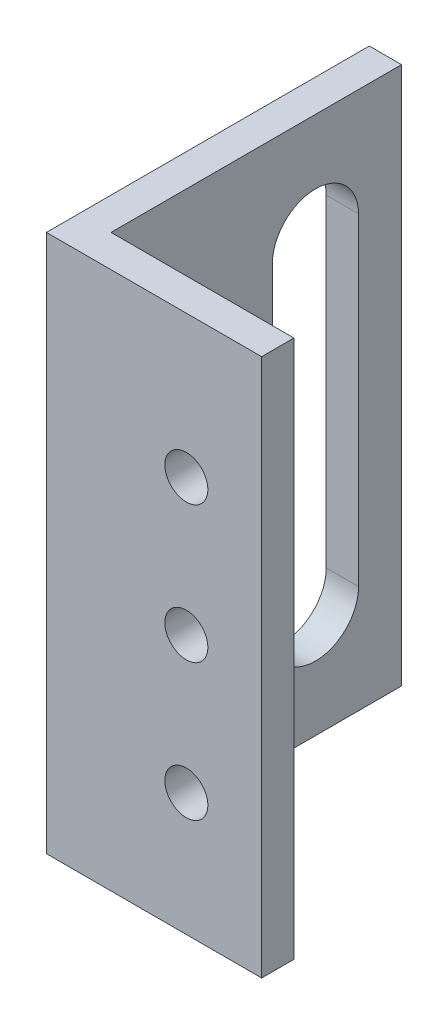
ISO-10303-21;
HEADER;
FILE_DESCRIPTION(('STEP AP214'),'2;1');
FILE_NAME('part.step','',(''),(''),'','','');
FILE_SCHEMA(('AUTOMOTIVE_DESIGN { 1 0 10303 214 1 1 1 1 }'));
ENDSEC;
DATA;
#1=APPLICATION_CONTEXT('core data for automotive mechanical design processes');
#2=APPLICATION_PROTOCOL_DEFINITION('international standard','automotive_design',2000,#1);
#3=PRODUCT_CONTEXT('',#1,'mechanical');
#4=PRODUCT('Part','Part','',(#3));
#5=PRODUCT_RELATED_PRODUCT_CATEGORY('part','',(#4));
#6=PRODUCT_DEFINITION_FORMATION('','',#4);
#7=PRODUCT_DEFINITION_CONTEXT('part definition',#1,'design');
#8=PRODUCT_DEFINITION('design','',#6,#7);
#9=PRODUCT_DEFINITION_SHAPE('','',#8);
#10=(LENGTH_UNIT() NAMED_UNIT(*) SI_UNIT(.MILLI.,.METRE.));
#11=(NAMED_UNIT(*) PLANE_ANGLE_UNIT() SI_UNIT($,.RADIAN.));
#12=(NAMED_UNIT(*) SI_UNIT($,.STERADIAN.) SOLID_ANGLE_UNIT());
#13=UNCERTAINTY_MEASURE_WITH_UNIT(LENGTH_MEASURE(1.E-05),#10,'distance_accuracy_value','');
#14=(GEOMETRIC_REPRESENTATION_CONTEXT(3) GLOBAL_UNCERTAINTY_ASSIGNED_CONTEXT((#13)) GLOBAL_UNIT_ASSIGNED_CONTEXT((#10,
#11,#12)) REPRESENTATION_CONTEXT('',''));
#15=CARTESIAN_POINT('',(0.,0.,0.));
#16=DIRECTION('',(0.,0.,1.));
#17=DIRECTION('',(1.,0.,0.));
#18=AXIS2_PLACEMENT_3D('',#15,#16,#17);
#19=CARTESIAN_POINT('',(-1.5,50.,0.));
#20=DIRECTION('',(1.,0.,0.));
#21=DIRECTION('',(0.,0.,-1.));
#22=AXIS2_PLACEMENT_3D('',#19,#20,#21);
#23=PLANE('',#22);
#24=DIRECTION('',(0.,-1.,0.));
#25=VECTOR('',#24,1.);
#26=CARTESIAN_POINT('',(-1.5,40.,-11.));
#27=LINE('',#26,#25);
#28=CARTESIAN_POINT('',(-1.5,40.,-11.));
#29=VERTEX_POINT('',#28);
#30=CARTESIAN_POINT('',(-1.5,10.,-11.));
#31=VERTEX_POINT('',#30);
#32=EDGE_CURVE('E128',#29,#31,#27,.T.);
#33=ORIENTED_EDGE('',*,*,#32,.F.);
#34=CARTESIAN_POINT('',(-1.5,40.,-7.));
#35=DIRECTION('',(-1.,0.,0.));
#36=DIRECTION('',(0.,0.,1.));
#37=AXIS2_PLACEMENT_3D('',#34,#35,#36);
#38=CIRCLE('',#37,4.);
#39=CARTESIAN_POINT('',(-1.5,40.,-3.));
#40=VERTEX_POINT('',#39);
#41=EDGE_CURVE('E55',#40,#29,#38,.T.);
#42=ORIENTED_EDGE('',*,*,#41,.F.);
#43=DIRECTION('',(0.,1.,0.));
#44=VECTOR('',#43,1.);
#45=CARTESIAN_POINT('',(-1.5,40.,-3.));
#46=LINE('',#45,#44);
#47=CARTESIAN_POINT('',(-1.5,10.,-3.));
#48=VERTEX_POINT('',#47);
#49=EDGE_CURVE('E134',#48,#40,#46,.T.);
#50=ORIENTED_EDGE('',*,*,#49,.F.);
#51=CARTESIAN_POINT('',(-1.5,10.,-7.));
#52=DIRECTION('',(-1.,0.,0.));
#53=DIRECTION('',(0.,0.,1.));
#54=AXIS2_PLACEMENT_3D('',#51,#52,#53);
#55=CIRCLE('',#54,4.);
#56=EDGE_CURVE('E119',#31,#48,#55,.T.);
#57=ORIENTED_EDGE('',*,*,#56,.F.);
#58=EDGE_LOOP('',(#33,#42,#50,#57));
#59=FACE_BOUND('',#58,.T.);
#60=DIRECTION('',(0.,0.,1.));
#61=VECTOR('',#60,1.);
#62=CARTESIAN_POINT('',(-1.5,0.,0.));
#63=LINE('',#62,#61);
#64=CARTESIAN_POINT('',(-1.5,0.,-15.));
#65=VERTEX_POINT('',#64);
#66=CARTESIAN_POINT('',(-1.5,0.,15.));
#67=VERTEX_POINT('',#66);
#68=EDGE_CURVE('E171',#65,#67,#63,.T.);
#69=ORIENTED_EDGE('',*,*,#68,.T.);
#70=DIRECTION('',(0.,-1.,0.));
#71=VECTOR('',#70,1.);
#72=CARTESIAN_POINT('',(-1.5,50.,15.));
#73=LINE('',#72,#71);
#74=CARTESIAN_POINT('',(-1.5,50.,15.));
#75=VERTEX_POINT('',#74);
#76=EDGE_CURVE('E198',#75,#67,#73,.T.);
#77=ORIENTED_EDGE('',*,*,#76,.F.);
#78=DIRECTION('',(0.,0.,1.));
#79=VECTOR('',#78,1.);
#80=CARTESIAN_POINT('',(-1.5,50.,0.));
#81=LINE('',#80,#79);
#82=CARTESIAN_POINT('',(-1.5,50.,-15.));
#83=VERTEX_POINT('',#82);
#84=EDGE_CURVE('E153',#83,#75,#81,.T.);
#85=ORIENTED_EDGE('',*,*,#84,.F.);
#86=DIRECTION('',(0.,-1.,0.));
#87=VECTOR('',#86,1.);
#88=CARTESIAN_POINT('',(-1.5,50.,-15.));
#89=LINE('',#88,#87);
#90=EDGE_CURVE('E170',#83,#65,#89,.T.);
#91=ORIENTED_EDGE('',*,*,#90,.T.);
#92=EDGE_LOOP('',(#69,#77,#85,#91));
#93=FACE_BOUND('',#92,.T.);
#94=ADVANCED_FACE('F41',(#59,#93),#23,.F.);
#95=CARTESIAN_POINT('',(0.,50.,15.));
#96=DIRECTION('',(0.,0.,-1.));
#97=DIRECTION('',(-1.,0.,0.));
#98=AXIS2_PLACEMENT_3D('',#95,#96,#97);
#99=PLANE('',#98);
#100=CARTESIAN_POINT('',(11.5,36.8,15.));
#101=DIRECTION('',(0.,0.,1.));
#102=DIRECTION('',(1.,0.,0.));
#103=AXIS2_PLACEMENT_3D('',#100,#101,#102);
#104=CIRCLE('',#103,2.);
#105=CARTESIAN_POINT('',(13.5,36.8,15.));
#106=VERTEX_POINT('',#105);
#107=EDGE_CURVE('E144',#106,#106,#104,.T.);
#108=ORIENTED_EDGE('',*,*,#107,.F.);
#109=EDGE_LOOP('',(#108));
#110=FACE_BOUND('',#109,.T.);
#111=CARTESIAN_POINT('',(11.5000000000001,24.1,15.));
#112=DIRECTION('',(0.,0.,1.));
#113=DIRECTION('',(1.,0.,0.));
#114=AXIS2_PLACEMENT_3D('',#111,#112,#113);
#115=CIRCLE('',#114,2.);
#116=CARTESIAN_POINT('',(13.5000000000001,24.1,15.));
#117=VERTEX_POINT('',#116);
#118=EDGE_CURVE('E148',#117,#117,#115,.T.);
#119=ORIENTED_EDGE('',*,*,#118,.F.);
#120=EDGE_LOOP('',(#119));
#121=FACE_BOUND('',#120,.T.);
#122=CARTESIAN_POINT('',(11.5000000000003,11.4,15.));
#123=DIRECTION('',(0.,0.,1.));
#124=DIRECTION('',(1.,0.,0.));
#125=AXIS2_PLACEMENT_3D('',#122,#123,#124);
#126=CIRCLE('',#125,2.);
#127=CARTESIAN_POINT('',(13.5000000000003,11.4,15.));
#128=VERTEX_POINT('',#127);
#129=EDGE_CURVE('E141',#128,#128,#126,.T.);
#130=ORIENTED_EDGE('',*,*,#129,.F.);
#131=EDGE_LOOP('',(#130));
#132=FACE_BOUND('',#131,.T.);
#133=DIRECTION('',(1.,0.,0.));
#134=VECTOR('',#133,1.);
#135=CARTESIAN_POINT('',(0.,0.,15.));
#136=LINE('',#135,#134);
#137=CARTESIAN_POINT('',(18.5,0.,15.));
#138=VERTEX_POINT('',#137);
#139=EDGE_CURVE('E174',#67,#138,#136,.T.);
#140=ORIENTED_EDGE('',*,*,#139,.T.);
#141=DIRECTION('',(0.,-1.,0.));
#142=VECTOR('',#141,1.);
#143=CARTESIAN_POINT('',(18.5,50.,15.));
#144=LINE('',#143,#142);
#145=CARTESIAN_POINT('',(18.5,50.,15.));
#146=VERTEX_POINT('',#145);
#147=EDGE_CURVE('E195',#146,#138,#144,.T.);
#148=ORIENTED_EDGE('',*,*,#147,.F.);
#149=DIRECTION('',(1.,0.,0.));
#150=VECTOR('',#149,1.);
#151=CARTESIAN_POINT('',(0.,50.,15.));
#152=LINE('',#151,#150);
#153=EDGE_CURVE('E156',#75,#146,#152,.T.);
#154=ORIENTED_EDGE('',*,*,#153,.F.);
#155=ORIENTED_EDGE('',*,*,#76,.T.);
#156=EDGE_LOOP('',(#140,#148,#154,#155));
#157=FACE_BOUND('',#156,.T.);
#158=ADVANCED_FACE('F233',(#110,#121,#132,#157),#99,.F.);
#159=CARTESIAN_POINT('',(18.5,50.,0.));
#160=DIRECTION('',(-1.,0.,0.));
#161=DIRECTION('',(0.,0.,1.));
#162=AXIS2_PLACEMENT_3D('',#159,#160,#161);
#163=PLANE('',#162);
#164=DIRECTION('',(0.,0.,-1.));
#165=VECTOR('',#164,1.);
#166=CARTESIAN_POINT('',(18.5,0.,0.));
#167=LINE('',#166,#165);
#168=CARTESIAN_POINT('',(18.5,0.,12.));
#169=VERTEX_POINT('',#168);
#170=EDGE_CURVE('E177',#138,#169,#167,.T.);
#171=ORIENTED_EDGE('',*,*,#170,.T.);
#172=DIRECTION('',(0.,-1.,0.));
#173=VECTOR('',#172,1.);
#174=CARTESIAN_POINT('',(18.5,50.,12.));
#175=LINE('',#174,#173);
#176=CARTESIAN_POINT('',(18.5,50.,12.));
#177=VERTEX_POINT('',#176);
#178=EDGE_CURVE('E193',#177,#169,#175,.T.);
#179=ORIENTED_EDGE('',*,*,#178,.F.);
#180=DIRECTION('',(0.,0.,-1.));
#181=VECTOR('',#180,1.);
#182=CARTESIAN_POINT('',(18.5,50.,0.));
#183=LINE('',#182,#181);
#184=EDGE_CURVE('E159',#146,#177,#183,.T.);
#185=ORIENTED_EDGE('',*,*,#184,.F.);
#186=ORIENTED_EDGE('',*,*,#147,.T.);
#187=EDGE_LOOP('',(#171,#179,#185,#186));
#188=FACE_BOUND('',#187,.T.);
#189=ADVANCED_FACE('F237',(#188),#163,.F.);
#190=CARTESIAN_POINT('',(0.,50.,12.));
#191=DIRECTION('',(0.,0.,-1.));
#192=DIRECTION('',(-1.,0.,0.));
#193=AXIS2_PLACEMENT_3D('',#190,#191,#192);
#194=PLANE('',#193);
#195=CARTESIAN_POINT('',(11.5,36.8,12.));
#196=DIRECTION('',(0.,0.,-1.));
#197=DIRECTION('',(-1.,0.,0.));
#198=AXIS2_PLACEMENT_3D('',#195,#196,#197);
#199=CIRCLE('',#198,2.);
#200=CARTESIAN_POINT('',(9.50000000000001,36.8,12.));
#201=VERTEX_POINT('',#200);
#202=EDGE_CURVE('E175',#201,#201,#199,.T.);
#203=ORIENTED_EDGE('',*,*,#202,.F.);
#204=EDGE_LOOP('',(#203));
#205=FACE_BOUND('',#204,.T.);
#206=CARTESIAN_POINT('',(11.5000000000001,24.1,12.));
#207=DIRECTION('',(0.,0.,-1.));
#208=DIRECTION('',(-1.,0.,0.));
#209=AXIS2_PLACEMENT_3D('',#206,#207,#208);
#210=CIRCLE('',#209,2.);
#211=CARTESIAN_POINT('',(9.50000000000014,24.1,12.));
#212=VERTEX_POINT('',#211);
#213=EDGE_CURVE('E204',#212,#212,#210,.T.);
#214=ORIENTED_EDGE('',*,*,#213,.F.);
#215=EDGE_LOOP('',(#214));
#216=FACE_BOUND('',#215,.T.);
#217=CARTESIAN_POINT('',(11.5000000000003,11.4,12.));
#218=DIRECTION('',(0.,0.,-1.));
#219=DIRECTION('',(-1.,0.,0.));
#220=AXIS2_PLACEMENT_3D('',#217,#218,#219);
#221=CIRCLE('',#220,2.);
#222=CARTESIAN_POINT('',(9.50000000000027,11.4,12.));
#223=VERTEX_POINT('',#222);
#224=EDGE_CURVE('E147',#223,#223,#221,.T.);
#225=ORIENTED_EDGE('',*,*,#224,.F.);
#226=EDGE_LOOP('',(#225));
#227=FACE_BOUND('',#226,.T.);
#228=DIRECTION('',(1.,0.,0.));
#229=VECTOR('',#228,1.);
#230=CARTESIAN_POINT('',(0.,0.,12.));
#231=LINE('',#230,#229);
#232=CARTESIAN_POINT('',(1.5,0.,12.));
#233=VERTEX_POINT('',#232);
#234=EDGE_CURVE('E180',#233,#169,#231,.T.);
#235=ORIENTED_EDGE('',*,*,#234,.F.);
#236=DIRECTION('',(0.,-1.,0.));
#237=VECTOR('',#236,1.);
#238=CARTESIAN_POINT('',(1.5,50.,12.));
#239=LINE('',#238,#237);
#240=CARTESIAN_POINT('',(1.5,50.,12.));
#241=VERTEX_POINT('',#240);
#242=EDGE_CURVE('E191',#241,#233,#239,.T.);
#243=ORIENTED_EDGE('',*,*,#242,.F.);
#244=DIRECTION('',(1.,0.,0.));
#245=VECTOR('',#244,1.);
#246=CARTESIAN_POINT('',(0.,50.,12.));
#247=LINE('',#246,#245);
#248=EDGE_CURVE('E161',#241,#177,#247,.T.);
#249=ORIENTED_EDGE('',*,*,#248,.T.);
#250=ORIENTED_EDGE('',*,*,#178,.T.);
#251=EDGE_LOOP('',(#235,#243,#249,#250));
#252=FACE_BOUND('',#251,.T.);
#253=ADVANCED_FACE('F244',(#205,#216,#227,#252),#194,.T.);
#254=CARTESIAN_POINT('',(1.5,50.,0.));
#255=DIRECTION('',(1.,0.,0.));
#256=DIRECTION('',(0.,0.,-1.));
#257=AXIS2_PLACEMENT_3D('',#254,#255,#256);
#258=PLANE('',#257);
#259=CARTESIAN_POINT('',(1.5,40.,-7.));
#260=DIRECTION('',(1.,0.,0.));
#261=DIRECTION('',(0.,0.,-1.));
#262=AXIS2_PLACEMENT_3D('',#259,#260,#261);
#263=CIRCLE('',#262,4.);
#264=CARTESIAN_POINT('',(1.5,40.,-11.));
#265=VERTEX_POINT('',#264);
#266=CARTESIAN_POINT('',(1.5,40.,-3.));
#267=VERTEX_POINT('',#266);
#268=EDGE_CURVE('E11',#265,#267,#263,.T.);
#269=ORIENTED_EDGE('',*,*,#268,.F.);
#270=DIRECTION('',(0.,1.,0.));
#271=VECTOR('',#270,1.);
#272=CARTESIAN_POINT('',(1.5,50.,-11.));
#273=LINE('',#272,#271);
#274=CARTESIAN_POINT('',(1.5,10.,-11.));
#275=VERTEX_POINT('',#274);
#276=EDGE_CURVE('E201',#275,#265,#273,.T.);
#277=ORIENTED_EDGE('',*,*,#276,.F.);
#278=CARTESIAN_POINT('',(1.5,10.,-7.));
#279=DIRECTION('',(1.,0.,0.));
#280=DIRECTION('',(0.,0.,-1.));
#281=AXIS2_PLACEMENT_3D('',#278,#279,#280);
#282=CIRCLE('',#281,4.);
#283=CARTESIAN_POINT('',(1.5,10.,-3.));
#284=VERTEX_POINT('',#283);
#285=EDGE_CURVE('E122',#284,#275,#282,.T.);
#286=ORIENTED_EDGE('',*,*,#285,.F.);
#287=DIRECTION('',(0.,-1.,0.));
#288=VECTOR('',#287,1.);
#289=CARTESIAN_POINT('',(1.5,50.,-3.));
#290=LINE('',#289,#288);
#291=EDGE_CURVE('E48',#267,#284,#290,.T.);
#292=ORIENTED_EDGE('',*,*,#291,.F.);
#293=EDGE_LOOP('',(#269,#277,#286,#292));
#294=FACE_BOUND('',#293,.T.);
#295=DIRECTION('',(0.,0.,1.));
#296=VECTOR('',#295,1.);
#297=CARTESIAN_POINT('',(1.5,0.,0.));
#298=LINE('',#297,#296);
#299=CARTESIAN_POINT('',(1.5,0.,-15.));
#300=VERTEX_POINT('',#299);
#301=EDGE_CURVE('E183',#300,#233,#298,.T.);
#302=ORIENTED_EDGE('',*,*,#301,.F.);
#303=DIRECTION('',(0.,-1.,0.));
#304=VECTOR('',#303,1.);
#305=CARTESIAN_POINT('',(1.5,50.,-15.));
#306=LINE('',#305,#304);
#307=CARTESIAN_POINT('',(1.5,50.,-15.));
#308=VERTEX_POINT('',#307);
#309=EDGE_CURVE('E189',#308,#300,#306,.T.);
#310=ORIENTED_EDGE('',*,*,#309,.F.);
#311=DIRECTION('',(0.,0.,1.));
#312=VECTOR('',#311,1.);
#313=CARTESIAN_POINT('',(1.5,50.,0.));
#314=LINE('',#313,#312);
#315=EDGE_CURVE('E164',#308,#241,#314,.T.);
#316=ORIENTED_EDGE('',*,*,#315,.T.);
#317=ORIENTED_EDGE('',*,*,#242,.T.);
#318=EDGE_LOOP('',(#302,#310,#316,#317));
#319=FACE_BOUND('',#318,.T.);
#320=ADVANCED_FACE('F216',(#294,#319),#258,.T.);
#321=CARTESIAN_POINT('',(0.,50.,-15.));
#322=DIRECTION('',(0.,0.,-1.));
#323=DIRECTION('',(-1.,0.,0.));
#324=AXIS2_PLACEMENT_3D('',#321,#322,#323);
#325=PLANE('',#324);
#326=DIRECTION('',(1.,0.,0.));
#327=VECTOR('',#326,1.);
#328=CARTESIAN_POINT('',(0.,0.,-15.));
#329=LINE('',#328,#327);
#330=EDGE_CURVE('E157',#65,#300,#329,.T.);
#331=ORIENTED_EDGE('',*,*,#330,.F.);
#332=ORIENTED_EDGE('',*,*,#90,.F.);
#333=DIRECTION('',(1.,0.,0.));
#334=VECTOR('',#333,1.);
#335=CARTESIAN_POINT('',(0.,50.,-15.));
#336=LINE('',#335,#334);
#337=EDGE_CURVE('E167',#83,#308,#336,.T.);
#338=ORIENTED_EDGE('',*,*,#337,.T.);
#339=ORIENTED_EDGE('',*,*,#309,.T.);
#340=EDGE_LOOP('',(#331,#332,#338,#339));
#341=FACE_BOUND('',#340,.T.);
#342=ADVANCED_FACE('F253',(#341),#325,.T.);
#343=CARTESIAN_POINT('',(0.,50.,0.));
#344=DIRECTION('',(0.,1.,0.));
#345=DIRECTION('',(0.,0.,1.));
#346=AXIS2_PLACEMENT_3D('',#343,#344,#345);
#347=PLANE('',#346);
#348=ORIENTED_EDGE('',*,*,#84,.T.);
#349=ORIENTED_EDGE('',*,*,#153,.T.);
#350=ORIENTED_EDGE('',*,*,#184,.T.);
#351=ORIENTED_EDGE('',*,*,#248,.F.);
#352=ORIENTED_EDGE('',*,*,#315,.F.);
#353=ORIENTED_EDGE('',*,*,#337,.F.);
#354=EDGE_LOOP('',(#348,#349,#350,#351,#352,#353));
#355=FACE_BOUND('',#354,.T.);
#356=ADVANCED_FACE('F256',(#355),#347,.T.);
#357=CARTESIAN_POINT('',(0.,0.,0.));
#358=DIRECTION('',(0.,1.,0.));
#359=DIRECTION('',(0.,0.,1.));
#360=AXIS2_PLACEMENT_3D('',#357,#358,#359);
#361=PLANE('',#360);
#362=ORIENTED_EDGE('',*,*,#68,.F.);
#363=ORIENTED_EDGE('',*,*,#330,.T.);
#364=ORIENTED_EDGE('',*,*,#301,.T.);
#365=ORIENTED_EDGE('',*,*,#234,.T.);
#366=ORIENTED_EDGE('',*,*,#170,.F.);
#367=ORIENTED_EDGE('',*,*,#139,.F.);
#368=EDGE_LOOP('',(#362,#363,#364,#365,#366,#367));
#369=FACE_BOUND('',#368,.T.);
#370=ADVANCED_FACE('F258',(#369),#361,.F.);
#371=CARTESIAN_POINT('',(11.5000000000003,11.4,5.));
#372=DIRECTION('',(0.,0.,1.));
#373=DIRECTION('',(1.,0.,0.));
#374=AXIS2_PLACEMENT_3D('',#371,#372,#373);
#375=CYLINDRICAL_SURFACE('',#374,2.);
#376=ORIENTED_EDGE('',*,*,#224,.T.);
#377=EDGE_LOOP('',(#376));
#378=FACE_BOUND('',#377,.T.);
#379=ORIENTED_EDGE('',*,*,#129,.T.);
#380=EDGE_LOOP('',(#379));
#381=FACE_BOUND('',#380,.T.);
#382=ADVANCED_FACE('F260',(#378,#381),#375,.F.);
#383=CARTESIAN_POINT('',(11.5000000000001,24.1,5.));
#384=DIRECTION('',(0.,0.,1.));
#385=DIRECTION('',(1.,0.,0.));
#386=AXIS2_PLACEMENT_3D('',#383,#384,#385);
#387=CYLINDRICAL_SURFACE('',#386,2.);
#388=ORIENTED_EDGE('',*,*,#213,.T.);
#389=EDGE_LOOP('',(#388));
#390=FACE_BOUND('',#389,.T.);
#391=ORIENTED_EDGE('',*,*,#118,.T.);
#392=EDGE_LOOP('',(#391));
#393=FACE_BOUND('',#392,.T.);
#394=ADVANCED_FACE('F228',(#390,#393),#387,.F.);
#395=CARTESIAN_POINT('',(11.5,36.8,5.));
#396=DIRECTION('',(0.,0.,1.));
#397=DIRECTION('',(1.,0.,0.));
#398=AXIS2_PLACEMENT_3D('',#395,#396,#397);
#399=CYLINDRICAL_SURFACE('',#398,2.);
#400=ORIENTED_EDGE('',*,*,#202,.T.);
#401=EDGE_LOOP('',(#400));
#402=FACE_BOUND('',#401,.T.);
#403=ORIENTED_EDGE('',*,*,#107,.T.);
#404=EDGE_LOOP('',(#403));
#405=FACE_BOUND('',#404,.T.);
#406=ADVANCED_FACE('F220',(#402,#405),#399,.F.);
#407=CARTESIAN_POINT('',(8.5,40.,-7.));
#408=DIRECTION('',(-1.,0.,0.));
#409=DIRECTION('',(0.,0.,1.));
#410=AXIS2_PLACEMENT_3D('',#407,#408,#409);
#411=CYLINDRICAL_SURFACE('',#410,4.);
#412=ORIENTED_EDGE('',*,*,#268,.T.);
#413=DIRECTION('',(-1.,0.,0.));
#414=VECTOR('',#413,1.);
#415=CARTESIAN_POINT('',(8.5,40.,-3.));
#416=LINE('',#415,#414);
#417=EDGE_CURVE('E139',#267,#40,#416,.T.);
#418=ORIENTED_EDGE('',*,*,#417,.T.);
#419=ORIENTED_EDGE('',*,*,#41,.T.);
#420=DIRECTION('',(-1.,0.,0.));
#421=VECTOR('',#420,1.);
#422=CARTESIAN_POINT('',(8.5,40.,-11.));
#423=LINE('',#422,#421);
#424=EDGE_CURVE('E125',#265,#29,#423,.T.);
#425=ORIENTED_EDGE('',*,*,#424,.F.);
#426=EDGE_LOOP('',(#412,#418,#419,#425));
#427=FACE_BOUND('',#426,.T.);
#428=ADVANCED_FACE('F218',(#427),#411,.F.);
#429=CARTESIAN_POINT('',(8.5,40.,-3.));
#430=DIRECTION('',(0.,0.,1.));
#431=DIRECTION('',(1.,0.,0.));
#432=AXIS2_PLACEMENT_3D('',#429,#430,#431);
#433=PLANE('',#432);
#434=ORIENTED_EDGE('',*,*,#291,.T.);
#435=DIRECTION('',(-1.,0.,0.));
#436=VECTOR('',#435,1.);
#437=CARTESIAN_POINT('',(8.5,10.,-3.));
#438=LINE('',#437,#436);
#439=EDGE_CURVE('E124',#284,#48,#438,.T.);
#440=ORIENTED_EDGE('',*,*,#439,.T.);
#441=ORIENTED_EDGE('',*,*,#49,.T.);
#442=ORIENTED_EDGE('',*,*,#417,.F.);
#443=EDGE_LOOP('',(#434,#440,#441,#442));
#444=FACE_BOUND('',#443,.T.);
#445=ADVANCED_FACE('F213',(#444),#433,.F.);
#446=CARTESIAN_POINT('',(8.5,10.,-7.));
#447=DIRECTION('',(-1.,0.,0.));
#448=DIRECTION('',(0.,0.,1.));
#449=AXIS2_PLACEMENT_3D('',#446,#447,#448);
#450=CYLINDRICAL_SURFACE('',#449,4.);
#451=ORIENTED_EDGE('',*,*,#285,.T.);
#452=DIRECTION('',(-1.,0.,0.));
#453=VECTOR('',#452,1.);
#454=CARTESIAN_POINT('',(8.5,10.,-11.));
#455=LINE('',#454,#453);
#456=EDGE_CURVE('E63',#275,#31,#455,.T.);
#457=ORIENTED_EDGE('',*,*,#456,.T.);
#458=ORIENTED_EDGE('',*,*,#56,.T.);
#459=ORIENTED_EDGE('',*,*,#439,.F.);
#460=EDGE_LOOP('',(#451,#457,#458,#459));
#461=FACE_BOUND('',#460,.T.);
#462=ADVANCED_FACE('F116',(#461),#450,.F.);
#463=CARTESIAN_POINT('',(8.5,40.,-11.));
#464=DIRECTION('',(0.,0.,-1.));
#465=DIRECTION('',(-1.,0.,0.));
#466=AXIS2_PLACEMENT_3D('',#463,#464,#465);
#467=PLANE('',#466);
#468=ORIENTED_EDGE('',*,*,#276,.T.);
#469=ORIENTED_EDGE('',*,*,#424,.T.);
#470=ORIENTED_EDGE('',*,*,#32,.T.);
#471=ORIENTED_EDGE('',*,*,#456,.F.);
#472=EDGE_LOOP('',(#468,#469,#470,#471));
#473=FACE_BOUND('',#472,.T.);
#474=ADVANCED_FACE('F129',(#473),#467,.F.);
#475=CLOSED_SHELL('',(#94,#158,#189,#253,#320,#342,#356,#370,#382,#394,#406,#428,#445,#462,#474));
#476=MANIFOLD_SOLID_BREP('B2',#475);
#477=ADVANCED_BREP_SHAPE_REPRESENTATION('',(#18,#476),#14);
#478=SHAPE_DEFINITION_REPRESENTATION(#9,#477);
ENDSEC;
END-ISO-10303-21;
